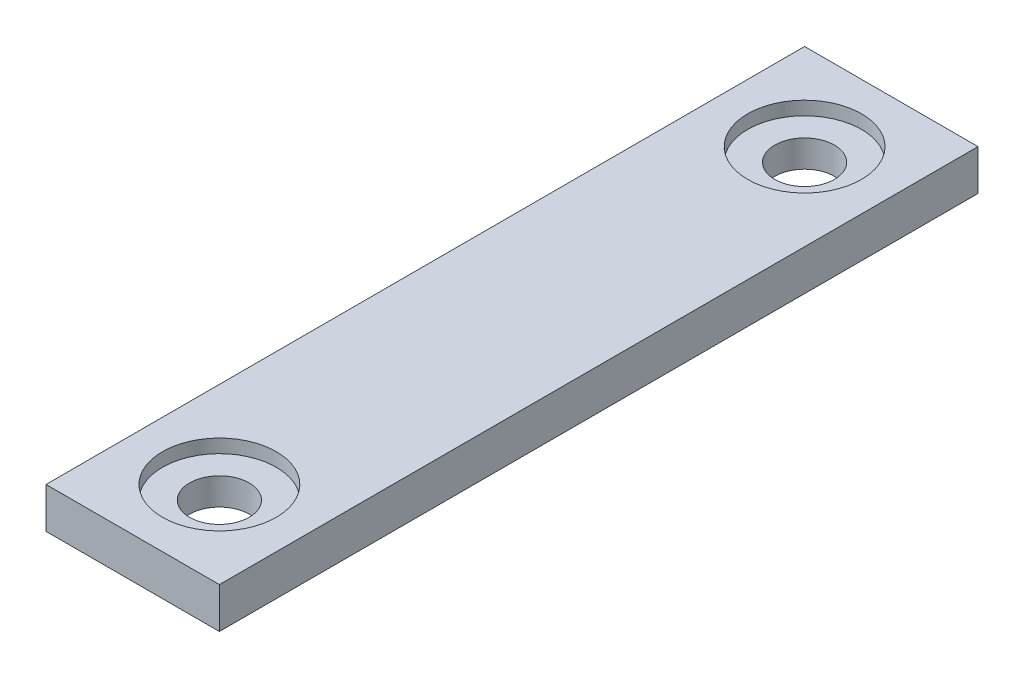
ISO-10303-21;
HEADER;
FILE_DESCRIPTION(('STEP AP214'),'2;1');
FILE_NAME('part.step','',(''),(''),'','','');
FILE_SCHEMA(('AUTOMOTIVE_DESIGN { 1 0 10303 214 1 1 1 1 }'));
ENDSEC;
DATA;
#1=APPLICATION_CONTEXT('core data for automotive mechanical design processes');
#2=APPLICATION_PROTOCOL_DEFINITION('international standard','automotive_design',2000,#1);
#3=PRODUCT_CONTEXT('',#1,'mechanical');
#4=PRODUCT('Part','Part','',(#3));
#5=PRODUCT_RELATED_PRODUCT_CATEGORY('part','',(#4));
#6=PRODUCT_DEFINITION_FORMATION('','',#4);
#7=PRODUCT_DEFINITION_CONTEXT('part definition',#1,'design');
#8=PRODUCT_DEFINITION('design','',#6,#7);
#9=PRODUCT_DEFINITION_SHAPE('','',#8);
#10=(LENGTH_UNIT() NAMED_UNIT(*) SI_UNIT(.MILLI.,.METRE.));
#11=(NAMED_UNIT(*) PLANE_ANGLE_UNIT() SI_UNIT($,.RADIAN.));
#12=(NAMED_UNIT(*) SI_UNIT($,.STERADIAN.) SOLID_ANGLE_UNIT());
#13=UNCERTAINTY_MEASURE_WITH_UNIT(LENGTH_MEASURE(1.E-05),#10,'distance_accuracy_value','');
#14=(GEOMETRIC_REPRESENTATION_CONTEXT(3) GLOBAL_UNCERTAINTY_ASSIGNED_CONTEXT((#13)) GLOBAL_UNIT_ASSIGNED_CONTEXT((#10,
#11,#12)) REPRESENTATION_CONTEXT('',''));
#15=CARTESIAN_POINT('',(0.,0.,0.));
#16=DIRECTION('',(0.,0.,1.));
#17=DIRECTION('',(1.,0.,0.));
#18=AXIS2_PLACEMENT_3D('',#15,#16,#17);
#19=CARTESIAN_POINT('',(0.,0.,10.8));
#20=DIRECTION('',(0.,1.,0.));
#21=DIRECTION('',(0.,0.,1.));
#22=AXIS2_PLACEMENT_3D('',#19,#20,#21);
#23=CYLINDRICAL_SURFACE('',#22,1.1);
#24=CARTESIAN_POINT('',(0.,0.,10.8));
#25=DIRECTION('',(0.,1.,0.));
#26=DIRECTION('',(0.,0.,-1.));
#27=AXIS2_PLACEMENT_3D('',#24,#25,#26);
#28=CIRCLE('',#27,1.1);
#29=CARTESIAN_POINT('',(0.,0.,9.7));
#30=VERTEX_POINT('',#29);
#31=EDGE_CURVE('E116',#30,#30,#28,.T.);
#32=ORIENTED_EDGE('',*,*,#31,.F.);
#33=EDGE_LOOP('',(#32));
#34=FACE_BOUND('',#33,.T.);
#35=CARTESIAN_POINT('',(0.,1.,10.8));
#36=DIRECTION('',(0.,1.,0.));
#37=DIRECTION('',(0.,0.,1.));
#38=AXIS2_PLACEMENT_3D('',#35,#36,#37);
#39=CIRCLE('',#38,1.1);
#40=CARTESIAN_POINT('',(0.,1.,11.9));
#41=VERTEX_POINT('',#40);
#42=EDGE_CURVE('E39',#41,#41,#39,.F.);
#43=ORIENTED_EDGE('',*,*,#42,.F.);
#44=EDGE_LOOP('',(#43));
#45=FACE_BOUND('',#44,.T.);
#46=ADVANCED_FACE('F35',(#34,#45),#23,.F.);
#47=CARTESIAN_POINT('',(0.,0.,-10.8));
#48=DIRECTION('',(0.,1.,0.));
#49=DIRECTION('',(0.,0.,1.));
#50=AXIS2_PLACEMENT_3D('',#47,#48,#49);
#51=CYLINDRICAL_SURFACE('',#50,1.1);
#52=CARTESIAN_POINT('',(0.,0.,-10.8));
#53=DIRECTION('',(0.,1.,0.));
#54=DIRECTION('',(0.,0.,1.));
#55=AXIS2_PLACEMENT_3D('',#52,#53,#54);
#56=CIRCLE('',#55,1.1);
#57=CARTESIAN_POINT('',(0.,0.,-9.7));
#58=VERTEX_POINT('',#57);
#59=EDGE_CURVE('E105',#58,#58,#56,.T.);
#60=ORIENTED_EDGE('',*,*,#59,.F.);
#61=EDGE_LOOP('',(#60));
#62=FACE_BOUND('',#61,.T.);
#63=CARTESIAN_POINT('',(0.,1.,-10.8));
#64=DIRECTION('',(0.,1.,0.));
#65=DIRECTION('',(0.,0.,1.));
#66=AXIS2_PLACEMENT_3D('',#63,#64,#65);
#67=CIRCLE('',#66,1.1);
#68=CARTESIAN_POINT('',(0.,1.,-9.7));
#69=VERTEX_POINT('',#68);
#70=EDGE_CURVE('E110',#69,#69,#67,.F.);
#71=ORIENTED_EDGE('',*,*,#70,.F.);
#72=EDGE_LOOP('',(#71));
#73=FACE_BOUND('',#72,.T.);
#74=ADVANCED_FACE('F141',(#62,#73),#51,.F.);
#75=CARTESIAN_POINT('',(-3.2,1.5,-14.));
#76=DIRECTION('',(1.,0.,0.));
#77=DIRECTION('',(0.,0.,-1.));
#78=AXIS2_PLACEMENT_3D('',#75,#76,#77);
#79=PLANE('',#78);
#80=DIRECTION('',(0.,0.,1.));
#81=VECTOR('',#80,1.);
#82=CARTESIAN_POINT('',(-3.2,0.,-14.));
#83=LINE('',#82,#81);
#84=CARTESIAN_POINT('',(-3.2,0.,-14.));
#85=VERTEX_POINT('',#84);
#86=CARTESIAN_POINT('',(-3.2,0.,14.));
#87=VERTEX_POINT('',#86);
#88=EDGE_CURVE('E102',#85,#87,#83,.T.);
#89=ORIENTED_EDGE('',*,*,#88,.T.);
#90=DIRECTION('',(0.,-1.,0.));
#91=VECTOR('',#90,1.);
#92=CARTESIAN_POINT('',(-3.2,1.5,14.));
#93=LINE('',#92,#91);
#94=CARTESIAN_POINT('',(-3.2,1.5,14.));
#95=VERTEX_POINT('',#94);
#96=EDGE_CURVE('E11',#95,#87,#93,.T.);
#97=ORIENTED_EDGE('',*,*,#96,.F.);
#98=DIRECTION('',(0.,0.,1.));
#99=VECTOR('',#98,1.);
#100=CARTESIAN_POINT('',(-3.2,1.5,-14.));
#101=LINE('',#100,#99);
#102=CARTESIAN_POINT('',(-3.2,1.5,-14.));
#103=VERTEX_POINT('',#102);
#104=EDGE_CURVE('E89',#103,#95,#101,.T.);
#105=ORIENTED_EDGE('',*,*,#104,.F.);
#106=DIRECTION('',(0.,-1.,0.));
#107=VECTOR('',#106,1.);
#108=CARTESIAN_POINT('',(-3.2,1.5,-14.));
#109=LINE('',#108,#107);
#110=EDGE_CURVE('E98',#103,#85,#109,.T.);
#111=ORIENTED_EDGE('',*,*,#110,.T.);
#112=EDGE_LOOP('',(#89,#97,#105,#111));
#113=FACE_BOUND('',#112,.T.);
#114=ADVANCED_FACE('F37',(#113),#79,.F.);
#115=CARTESIAN_POINT('',(3.2,1.5,14.));
#116=DIRECTION('',(0.,0.,-1.));
#117=DIRECTION('',(-1.,0.,0.));
#118=AXIS2_PLACEMENT_3D('',#115,#116,#117);
#119=PLANE('',#118);
#120=DIRECTION('',(1.,0.,0.));
#121=VECTOR('',#120,1.);
#122=CARTESIAN_POINT('',(3.2,0.,14.));
#123=LINE('',#122,#121);
#124=CARTESIAN_POINT('',(3.2,0.,14.));
#125=VERTEX_POINT('',#124);
#126=EDGE_CURVE('E93',#87,#125,#123,.T.);
#127=ORIENTED_EDGE('',*,*,#126,.T.);
#128=DIRECTION('',(0.,-1.,0.));
#129=VECTOR('',#128,1.);
#130=CARTESIAN_POINT('',(3.2,1.5,14.));
#131=LINE('',#130,#129);
#132=CARTESIAN_POINT('',(3.2,1.5,14.));
#133=VERTEX_POINT('',#132);
#134=EDGE_CURVE('E45',#133,#125,#131,.T.);
#135=ORIENTED_EDGE('',*,*,#134,.F.);
#136=DIRECTION('',(1.,0.,0.));
#137=VECTOR('',#136,1.);
#138=CARTESIAN_POINT('',(3.2,1.5,14.));
#139=LINE('',#138,#137);
#140=EDGE_CURVE('E84',#95,#133,#139,.T.);
#141=ORIENTED_EDGE('',*,*,#140,.F.);
#142=ORIENTED_EDGE('',*,*,#96,.T.);
#143=EDGE_LOOP('',(#127,#135,#141,#142));
#144=FACE_BOUND('',#143,.T.);
#145=ADVANCED_FACE('F92',(#144),#119,.F.);
#146=CARTESIAN_POINT('',(3.2,1.5,-14.));
#147=DIRECTION('',(-1.,0.,0.));
#148=DIRECTION('',(0.,0.,1.));
#149=AXIS2_PLACEMENT_3D('',#146,#147,#148);
#150=PLANE('',#149);
#151=DIRECTION('',(0.,0.,-1.));
#152=VECTOR('',#151,1.);
#153=CARTESIAN_POINT('',(3.2,0.,-14.));
#154=LINE('',#153,#152);
#155=CARTESIAN_POINT('',(3.2,0.,-14.));
#156=VERTEX_POINT('',#155);
#157=EDGE_CURVE('E71',#125,#156,#154,.T.);
#158=ORIENTED_EDGE('',*,*,#157,.T.);
#159=DIRECTION('',(0.,-1.,0.));
#160=VECTOR('',#159,1.);
#161=CARTESIAN_POINT('',(3.2,1.5,-14.));
#162=LINE('',#161,#160);
#163=CARTESIAN_POINT('',(3.2,1.5,-14.));
#164=VERTEX_POINT('',#163);
#165=EDGE_CURVE('E94',#164,#156,#162,.T.);
#166=ORIENTED_EDGE('',*,*,#165,.F.);
#167=DIRECTION('',(0.,0.,-1.));
#168=VECTOR('',#167,1.);
#169=CARTESIAN_POINT('',(3.2,1.5,-14.));
#170=LINE('',#169,#168);
#171=EDGE_CURVE('E87',#133,#164,#170,.T.);
#172=ORIENTED_EDGE('',*,*,#171,.F.);
#173=ORIENTED_EDGE('',*,*,#134,.T.);
#174=EDGE_LOOP('',(#158,#166,#172,#173));
#175=FACE_BOUND('',#174,.T.);
#176=ADVANCED_FACE('F96',(#175),#150,.F.);
#177=CARTESIAN_POINT('',(3.2,1.5,-14.));
#178=DIRECTION('',(0.,0.,1.));
#179=DIRECTION('',(1.,0.,0.));
#180=AXIS2_PLACEMENT_3D('',#177,#178,#179);
#181=PLANE('',#180);
#182=DIRECTION('',(-1.,0.,0.));
#183=VECTOR('',#182,1.);
#184=CARTESIAN_POINT('',(3.2,0.,-14.));
#185=LINE('',#184,#183);
#186=EDGE_CURVE('E77',#156,#85,#185,.T.);
#187=ORIENTED_EDGE('',*,*,#186,.T.);
#188=ORIENTED_EDGE('',*,*,#110,.F.);
#189=DIRECTION('',(-1.,0.,0.));
#190=VECTOR('',#189,1.);
#191=CARTESIAN_POINT('',(3.2,1.5,-14.));
#192=LINE('',#191,#190);
#193=EDGE_CURVE('E54',#164,#103,#192,.T.);
#194=ORIENTED_EDGE('',*,*,#193,.F.);
#195=ORIENTED_EDGE('',*,*,#165,.T.);
#196=EDGE_LOOP('',(#187,#188,#194,#195));
#197=FACE_BOUND('',#196,.T.);
#198=ADVANCED_FACE('F167',(#197),#181,.F.);
#199=CARTESIAN_POINT('',(0.,1.5,0.));
#200=DIRECTION('',(0.,-1.,0.));
#201=DIRECTION('',(0.,0.,-1.));
#202=AXIS2_PLACEMENT_3D('',#199,#200,#201);
#203=PLANE('',#202);
#204=CARTESIAN_POINT('',(0.,1.5,-10.8));
#205=DIRECTION('',(0.,1.,0.));
#206=DIRECTION('',(0.,0.,1.));
#207=AXIS2_PLACEMENT_3D('',#204,#205,#206);
#208=CIRCLE('',#207,2.1);
#209=CARTESIAN_POINT('',(0.,1.5,-8.7));
#210=VERTEX_POINT('',#209);
#211=EDGE_CURVE('E118',#210,#210,#208,.T.);
#212=ORIENTED_EDGE('',*,*,#211,.F.);
#213=EDGE_LOOP('',(#212));
#214=FACE_BOUND('',#213,.T.);
#215=CARTESIAN_POINT('',(0.,1.5,10.8));
#216=DIRECTION('',(0.,1.,0.));
#217=DIRECTION('',(0.,0.,1.));
#218=AXIS2_PLACEMENT_3D('',#215,#216,#217);
#219=CIRCLE('',#218,2.1);
#220=CARTESIAN_POINT('',(0.,1.5,12.9));
#221=VERTEX_POINT('',#220);
#222=EDGE_CURVE('E128',#221,#221,#219,.T.);
#223=ORIENTED_EDGE('',*,*,#222,.F.);
#224=EDGE_LOOP('',(#223));
#225=FACE_BOUND('',#224,.T.);
#226=ORIENTED_EDGE('',*,*,#104,.T.);
#227=ORIENTED_EDGE('',*,*,#140,.T.);
#228=ORIENTED_EDGE('',*,*,#171,.T.);
#229=ORIENTED_EDGE('',*,*,#193,.T.);
#230=EDGE_LOOP('',(#226,#227,#228,#229));
#231=FACE_BOUND('',#230,.T.);
#232=ADVANCED_FACE('F85',(#214,#225,#231),#203,.F.);
#233=CARTESIAN_POINT('',(0.,0.,0.));
#234=DIRECTION('',(0.,-1.,0.));
#235=DIRECTION('',(0.,0.,-1.));
#236=AXIS2_PLACEMENT_3D('',#233,#234,#235);
#237=PLANE('',#236);
#238=ORIENTED_EDGE('',*,*,#59,.T.);
#239=EDGE_LOOP('',(#238));
#240=FACE_BOUND('',#239,.T.);
#241=ORIENTED_EDGE('',*,*,#31,.T.);
#242=EDGE_LOOP('',(#241));
#243=FACE_BOUND('',#242,.T.);
#244=ORIENTED_EDGE('',*,*,#88,.F.);
#245=ORIENTED_EDGE('',*,*,#186,.F.);
#246=ORIENTED_EDGE('',*,*,#157,.F.);
#247=ORIENTED_EDGE('',*,*,#126,.F.);
#248=EDGE_LOOP('',(#244,#245,#246,#247));
#249=FACE_BOUND('',#248,.T.);
#250=ADVANCED_FACE('F136',(#240,#243,#249),#237,.T.);
#251=CARTESIAN_POINT('',(0.,1.,-10.8));
#252=DIRECTION('',(0.,1.,0.));
#253=DIRECTION('',(0.,0.,1.));
#254=AXIS2_PLACEMENT_3D('',#251,#252,#253);
#255=PLANE('',#254);
#256=CARTESIAN_POINT('',(0.,1.,-10.8));
#257=DIRECTION('',(0.,1.,0.));
#258=DIRECTION('',(0.,0.,1.));
#259=AXIS2_PLACEMENT_3D('',#256,#257,#258);
#260=CIRCLE('',#259,2.1);
#261=CARTESIAN_POINT('',(0.,1.,-8.7));
#262=VERTEX_POINT('',#261);
#263=EDGE_CURVE('E112',#262,#262,#260,.T.);
#264=ORIENTED_EDGE('',*,*,#263,.T.);
#265=EDGE_LOOP('',(#264));
#266=FACE_BOUND('',#265,.T.);
#267=ORIENTED_EDGE('',*,*,#70,.T.);
#268=EDGE_LOOP('',(#267));
#269=FACE_BOUND('',#268,.T.);
#270=ADVANCED_FACE('F157',(#266,#269),#255,.T.);
#271=CARTESIAN_POINT('',(0.,1.,-10.8));
#272=DIRECTION('',(0.,1.,0.));
#273=DIRECTION('',(0.,0.,1.));
#274=AXIS2_PLACEMENT_3D('',#271,#272,#273);
#275=CYLINDRICAL_SURFACE('',#274,2.1);
#276=ORIENTED_EDGE('',*,*,#263,.F.);
#277=EDGE_LOOP('',(#276));
#278=FACE_BOUND('',#277,.T.);
#279=ORIENTED_EDGE('',*,*,#211,.T.);
#280=EDGE_LOOP('',(#279));
#281=FACE_BOUND('',#280,.T.);
#282=ADVANCED_FACE('F148',(#278,#281),#275,.F.);
#283=CARTESIAN_POINT('',(0.,1.,10.8));
#284=DIRECTION('',(0.,1.,0.));
#285=DIRECTION('',(0.,0.,1.));
#286=AXIS2_PLACEMENT_3D('',#283,#284,#285);
#287=PLANE('',#286);
#288=CARTESIAN_POINT('',(0.,1.,10.8));
#289=DIRECTION('',(0.,1.,0.));
#290=DIRECTION('',(0.,0.,1.));
#291=AXIS2_PLACEMENT_3D('',#288,#289,#290);
#292=CIRCLE('',#291,2.1);
#293=CARTESIAN_POINT('',(0.,1.,12.9));
#294=VERTEX_POINT('',#293);
#295=EDGE_CURVE('E123',#294,#294,#292,.T.);
#296=ORIENTED_EDGE('',*,*,#295,.T.);
#297=EDGE_LOOP('',(#296));
#298=FACE_BOUND('',#297,.T.);
#299=ORIENTED_EDGE('',*,*,#42,.T.);
#300=EDGE_LOOP('',(#299));
#301=FACE_BOUND('',#300,.T.);
#302=ADVANCED_FACE('F145',(#298,#301),#287,.T.);
#303=CARTESIAN_POINT('',(0.,1.,10.8));
#304=DIRECTION('',(0.,1.,0.));
#305=DIRECTION('',(0.,0.,1.));
#306=AXIS2_PLACEMENT_3D('',#303,#304,#305);
#307=CYLINDRICAL_SURFACE('',#306,2.1);
#308=ORIENTED_EDGE('',*,*,#295,.F.);
#309=EDGE_LOOP('',(#308));
#310=FACE_BOUND('',#309,.T.);
#311=ORIENTED_EDGE('',*,*,#222,.T.);
#312=EDGE_LOOP('',(#311));
#313=FACE_BOUND('',#312,.T.);
#314=ADVANCED_FACE('F147',(#310,#313),#307,.F.);
#315=CLOSED_SHELL('',(#46,#74,#114,#145,#176,#198,#232,#250,#270,#282,#302,#314));
#316=MANIFOLD_SOLID_BREP('B2',#315);
#317=ADVANCED_BREP_SHAPE_REPRESENTATION('',(#18,#316),#14);
#318=SHAPE_DEFINITION_REPRESENTATION(#9,#317);
ENDSEC;
END-ISO-10303-21;
